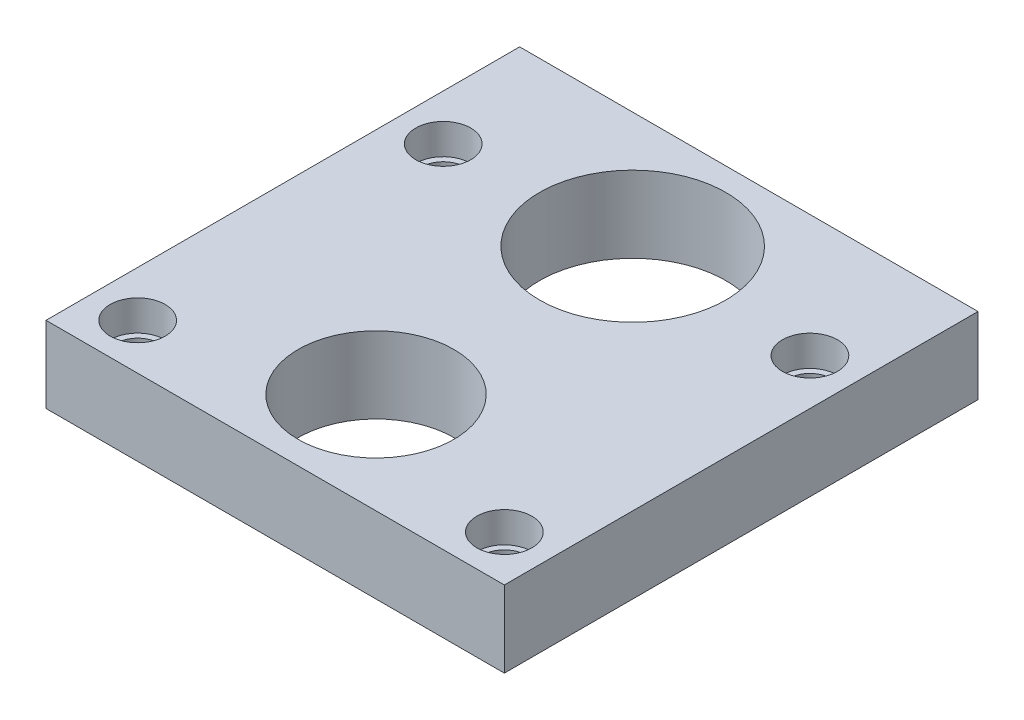
ISO-10303-21;
HEADER;
FILE_DESCRIPTION(('STEP AP214'),'2;1');
FILE_NAME('part.step','',(''),(''),'','','');
FILE_SCHEMA(('AUTOMOTIVE_DESIGN { 1 0 10303 214 1 1 1 1 }'));
ENDSEC;
DATA;
#1=APPLICATION_CONTEXT('core data for automotive mechanical design processes');
#2=APPLICATION_PROTOCOL_DEFINITION('international standard','automotive_design',2000,#1);
#3=PRODUCT_CONTEXT('',#1,'mechanical');
#4=PRODUCT('Part','Part','',(#3));
#5=PRODUCT_RELATED_PRODUCT_CATEGORY('part','',(#4));
#6=PRODUCT_DEFINITION_FORMATION('','',#4);
#7=PRODUCT_DEFINITION_CONTEXT('part definition',#1,'design');
#8=PRODUCT_DEFINITION('design','',#6,#7);
#9=PRODUCT_DEFINITION_SHAPE('','',#8);
#10=(LENGTH_UNIT() NAMED_UNIT(*) SI_UNIT(.MILLI.,.METRE.));
#11=(NAMED_UNIT(*) PLANE_ANGLE_UNIT() SI_UNIT($,.RADIAN.));
#12=(NAMED_UNIT(*) SI_UNIT($,.STERADIAN.) SOLID_ANGLE_UNIT());
#13=UNCERTAINTY_MEASURE_WITH_UNIT(LENGTH_MEASURE(1.E-05),#10,'distance_accuracy_value','');
#14=(GEOMETRIC_REPRESENTATION_CONTEXT(3) GLOBAL_UNCERTAINTY_ASSIGNED_CONTEXT((#13)) GLOBAL_UNIT_ASSIGNED_CONTEXT((#10,
#11,#12)) REPRESENTATION_CONTEXT('',''));
#15=CARTESIAN_POINT('',(0.,0.,0.));
#16=DIRECTION('',(0.,0.,1.));
#17=DIRECTION('',(1.,0.,0.));
#18=AXIS2_PLACEMENT_3D('',#15,#16,#17);
#19=CARTESIAN_POINT('',(0.,2.5,0.));
#20=DIRECTION('',(0.,-1.,0.));
#21=DIRECTION('',(0.,0.,-1.));
#22=AXIS2_PLACEMENT_3D('',#19,#20,#21);
#23=PLANE('',#22);
#24=CARTESIAN_POINT('',(-6.,2.5,-3.5));
#25=DIRECTION('',(0.,-1.,0.));
#26=DIRECTION('',(0.,0.,-1.));
#27=AXIS2_PLACEMENT_3D('',#24,#25,#26);
#28=CIRCLE('',#27,0.9);
#29=CARTESIAN_POINT('',(-6.,2.5,-4.4));
#30=VERTEX_POINT('',#29);
#31=EDGE_CURVE('E159',#30,#30,#28,.T.);
#32=ORIENTED_EDGE('',*,*,#31,.T.);
#33=EDGE_LOOP('',(#32));
#34=FACE_BOUND('',#33,.T.);
#35=CARTESIAN_POINT('',(6.,2.5,6.5));
#36=DIRECTION('',(0.,-1.,0.));
#37=DIRECTION('',(0.,0.,-1.));
#38=AXIS2_PLACEMENT_3D('',#35,#36,#37);
#39=CIRCLE('',#38,0.9);
#40=CARTESIAN_POINT('',(6.,2.5,5.6));
#41=VERTEX_POINT('',#40);
#42=EDGE_CURVE('E384',#41,#41,#39,.T.);
#43=ORIENTED_EDGE('',*,*,#42,.T.);
#44=EDGE_LOOP('',(#43));
#45=FACE_BOUND('',#44,.T.);
#46=CARTESIAN_POINT('',(6.,2.5,-3.5));
#47=DIRECTION('',(0.,-1.,0.));
#48=DIRECTION('',(0.,0.,-1.));
#49=AXIS2_PLACEMENT_3D('',#46,#47,#48);
#50=CIRCLE('',#49,0.9);
#51=CARTESIAN_POINT('',(6.,2.5,-4.4));
#52=VERTEX_POINT('',#51);
#53=EDGE_CURVE('E175',#52,#52,#50,.T.);
#54=ORIENTED_EDGE('',*,*,#53,.T.);
#55=EDGE_LOOP('',(#54));
#56=FACE_BOUND('',#55,.T.);
#57=CARTESIAN_POINT('',(-6.,2.5,6.5));
#58=DIRECTION('',(0.,-1.,0.));
#59=DIRECTION('',(0.,0.,-1.));
#60=AXIS2_PLACEMENT_3D('',#57,#58,#59);
#61=CIRCLE('',#60,0.899999999999999);
#62=CARTESIAN_POINT('',(-6.,2.5,5.6));
#63=VERTEX_POINT('',#62);
#64=EDGE_CURVE('E172',#63,#63,#61,.T.);
#65=ORIENTED_EDGE('',*,*,#64,.T.);
#66=EDGE_LOOP('',(#65));
#67=FACE_BOUND('',#66,.T.);
#68=DIRECTION('',(1.,0.,0.));
#69=VECTOR('',#68,1.);
#70=CARTESIAN_POINT('',(-7.5,2.5,-7.5));
#71=LINE('',#70,#69);
#72=CARTESIAN_POINT('',(-7.5,2.5,-7.5));
#73=VERTEX_POINT('',#72);
#74=CARTESIAN_POINT('',(7.5,2.5,-7.5));
#75=VERTEX_POINT('',#74);
#76=EDGE_CURVE('E128',#73,#75,#71,.T.);
#77=ORIENTED_EDGE('',*,*,#76,.F.);
#78=DIRECTION('',(0.,0.,1.));
#79=VECTOR('',#78,1.);
#80=CARTESIAN_POINT('',(-7.5,2.5,-7.5));
#81=LINE('',#80,#79);
#82=CARTESIAN_POINT('',(-7.5,2.5,8.));
#83=VERTEX_POINT('',#82);
#84=EDGE_CURVE('E117',#73,#83,#81,.T.);
#85=ORIENTED_EDGE('',*,*,#84,.T.);
#86=DIRECTION('',(1.,0.,0.));
#87=VECTOR('',#86,1.);
#88=CARTESIAN_POINT('',(-7.5,2.5,8.));
#89=LINE('',#88,#87);
#90=CARTESIAN_POINT('',(7.5,2.5,8.));
#91=VERTEX_POINT('',#90);
#92=EDGE_CURVE('E112',#83,#91,#89,.T.);
#93=ORIENTED_EDGE('',*,*,#92,.T.);
#94=DIRECTION('',(0.,0.,1.));
#95=VECTOR('',#94,1.);
#96=CARTESIAN_POINT('',(7.5,2.5,-7.5));
#97=LINE('',#96,#95);
#98=EDGE_CURVE('E116',#75,#91,#97,.T.);
#99=ORIENTED_EDGE('',*,*,#98,.F.);
#100=EDGE_LOOP('',(#77,#85,#93,#99));
#101=FACE_BOUND('',#100,.T.);
#102=CARTESIAN_POINT('',(0.,2.5,-3.7));
#103=DIRECTION('',(0.,1.,0.));
#104=DIRECTION('',(0.,0.,1.));
#105=AXIS2_PLACEMENT_3D('',#102,#103,#104);
#106=CIRCLE('',#105,3.05);
#107=CARTESIAN_POINT('',(0.,2.5,-0.650000000000001));
#108=VERTEX_POINT('',#107);
#109=EDGE_CURVE('E138',#108,#108,#106,.T.);
#110=ORIENTED_EDGE('',*,*,#109,.F.);
#111=EDGE_LOOP('',(#110));
#112=FACE_BOUND('',#111,.T.);
#113=CARTESIAN_POINT('',(0.,2.5,4.7));
#114=DIRECTION('',(0.,1.,0.));
#115=DIRECTION('',(0.,0.,1.));
#116=AXIS2_PLACEMENT_3D('',#113,#114,#115);
#117=CIRCLE('',#116,2.55);
#118=CARTESIAN_POINT('',(0.,2.5,7.25));
#119=VERTEX_POINT('',#118);
#120=EDGE_CURVE('E176',#119,#119,#117,.T.);
#121=ORIENTED_EDGE('',*,*,#120,.F.);
#122=EDGE_LOOP('',(#121));
#123=FACE_BOUND('',#122,.T.);
#124=ADVANCED_FACE('F65',(#34,#45,#56,#67,#101,#112,#123),#23,.F.);
#125=CARTESIAN_POINT('',(0.,0.,0.));
#126=DIRECTION('',(0.,-1.,0.));
#127=DIRECTION('',(0.,0.,-1.));
#128=AXIS2_PLACEMENT_3D('',#125,#126,#127);
#129=PLANE('',#128);
#130=CARTESIAN_POINT('',(6.,0.,6.5));
#131=DIRECTION('',(0.,-1.,0.));
#132=DIRECTION('',(0.,0.,-1.));
#133=AXIS2_PLACEMENT_3D('',#130,#131,#132);
#134=CIRCLE('',#133,0.7);
#135=CARTESIAN_POINT('',(6.,0.,5.8));
#136=VERTEX_POINT('',#135);
#137=EDGE_CURVE('E377',#136,#136,#134,.T.);
#138=ORIENTED_EDGE('',*,*,#137,.F.);
#139=EDGE_LOOP('',(#138));
#140=FACE_BOUND('',#139,.T.);
#141=CARTESIAN_POINT('',(-6.,0.,-3.5));
#142=DIRECTION('',(0.,-1.,0.));
#143=DIRECTION('',(0.,0.,-1.));
#144=AXIS2_PLACEMENT_3D('',#141,#142,#143);
#145=CIRCLE('',#144,0.7);
#146=CARTESIAN_POINT('',(-6.,0.,-4.2));
#147=VERTEX_POINT('',#146);
#148=EDGE_CURVE('E373',#147,#147,#145,.T.);
#149=ORIENTED_EDGE('',*,*,#148,.F.);
#150=EDGE_LOOP('',(#149));
#151=FACE_BOUND('',#150,.T.);
#152=CARTESIAN_POINT('',(6.,0.,-3.5));
#153=DIRECTION('',(0.,-1.,0.));
#154=DIRECTION('',(0.,0.,-1.));
#155=AXIS2_PLACEMENT_3D('',#152,#153,#154);
#156=CIRCLE('',#155,0.7);
#157=CARTESIAN_POINT('',(6.,0.,-4.2));
#158=VERTEX_POINT('',#157);
#159=EDGE_CURVE('E370',#158,#158,#156,.T.);
#160=ORIENTED_EDGE('',*,*,#159,.F.);
#161=EDGE_LOOP('',(#160));
#162=FACE_BOUND('',#161,.T.);
#163=CARTESIAN_POINT('',(-6.,0.,6.5));
#164=DIRECTION('',(0.,-1.,0.));
#165=DIRECTION('',(0.,0.,-1.));
#166=AXIS2_PLACEMENT_3D('',#163,#164,#165);
#167=CIRCLE('',#166,0.7);
#168=CARTESIAN_POINT('',(-6.,0.,5.8));
#169=VERTEX_POINT('',#168);
#170=EDGE_CURVE('E148',#169,#169,#167,.T.);
#171=ORIENTED_EDGE('',*,*,#170,.F.);
#172=EDGE_LOOP('',(#171));
#173=FACE_BOUND('',#172,.T.);
#174=CARTESIAN_POINT('',(0.,0.,-3.7));
#175=DIRECTION('',(0.,1.,0.));
#176=DIRECTION('',(0.,0.,1.));
#177=AXIS2_PLACEMENT_3D('',#174,#175,#176);
#178=CIRCLE('',#177,3.05);
#179=CARTESIAN_POINT('',(0.,0.,-0.650000000000001));
#180=VERTEX_POINT('',#179);
#181=EDGE_CURVE('E179',#180,#180,#178,.T.);
#182=ORIENTED_EDGE('',*,*,#181,.T.);
#183=EDGE_LOOP('',(#182));
#184=FACE_BOUND('',#183,.T.);
#185=DIRECTION('',(1.,0.,0.));
#186=VECTOR('',#185,1.);
#187=CARTESIAN_POINT('',(-7.5,0.,-7.5));
#188=LINE('',#187,#186);
#189=CARTESIAN_POINT('',(-7.5,0.,-7.5));
#190=VERTEX_POINT('',#189);
#191=CARTESIAN_POINT('',(7.5,0.,-7.5));
#192=VERTEX_POINT('',#191);
#193=EDGE_CURVE('E134',#190,#192,#188,.T.);
#194=ORIENTED_EDGE('',*,*,#193,.T.);
#195=DIRECTION('',(0.,0.,1.));
#196=VECTOR('',#195,1.);
#197=CARTESIAN_POINT('',(7.5,0.,-7.5));
#198=LINE('',#197,#196);
#199=CARTESIAN_POINT('',(7.5,0.,8.));
#200=VERTEX_POINT('',#199);
#201=EDGE_CURVE('E137',#192,#200,#198,.T.);
#202=ORIENTED_EDGE('',*,*,#201,.T.);
#203=DIRECTION('',(1.,0.,0.));
#204=VECTOR('',#203,1.);
#205=CARTESIAN_POINT('',(-7.5,0.,8.));
#206=LINE('',#205,#204);
#207=CARTESIAN_POINT('',(-7.5,0.,8.));
#208=VERTEX_POINT('',#207);
#209=EDGE_CURVE('E124',#208,#200,#206,.T.);
#210=ORIENTED_EDGE('',*,*,#209,.F.);
#211=DIRECTION('',(0.,0.,1.));
#212=VECTOR('',#211,1.);
#213=CARTESIAN_POINT('',(-7.5,0.,-7.5));
#214=LINE('',#213,#212);
#215=EDGE_CURVE('E99',#190,#208,#214,.T.);
#216=ORIENTED_EDGE('',*,*,#215,.F.);
#217=EDGE_LOOP('',(#194,#202,#210,#216));
#218=FACE_BOUND('',#217,.T.);
#219=CARTESIAN_POINT('',(0.,0.,4.7));
#220=DIRECTION('',(0.,1.,0.));
#221=DIRECTION('',(0.,0.,1.));
#222=AXIS2_PLACEMENT_3D('',#219,#220,#221);
#223=CIRCLE('',#222,2.55);
#224=CARTESIAN_POINT('',(0.,0.,7.25));
#225=VERTEX_POINT('',#224);
#226=EDGE_CURVE('E171',#225,#225,#223,.T.);
#227=ORIENTED_EDGE('',*,*,#226,.T.);
#228=EDGE_LOOP('',(#227));
#229=FACE_BOUND('',#228,.T.);
#230=ADVANCED_FACE('F186',(#140,#151,#162,#173,#184,#218,#229),#129,.T.);
#231=CARTESIAN_POINT('',(-7.5,2.5,-7.5));
#232=DIRECTION('',(0.,0.,-1.));
#233=DIRECTION('',(-1.,0.,0.));
#234=AXIS2_PLACEMENT_3D('',#231,#232,#233);
#235=PLANE('',#234);
#236=ORIENTED_EDGE('',*,*,#193,.F.);
#237=DIRECTION('',(0.,-1.,0.));
#238=VECTOR('',#237,1.);
#239=CARTESIAN_POINT('',(-7.5,2.5,-7.5));
#240=LINE('',#239,#238);
#241=EDGE_CURVE('E12',#73,#190,#240,.T.);
#242=ORIENTED_EDGE('',*,*,#241,.F.);
#243=ORIENTED_EDGE('',*,*,#76,.T.);
#244=DIRECTION('',(0.,-1.,0.));
#245=VECTOR('',#244,1.);
#246=CARTESIAN_POINT('',(7.5,2.5,-7.5));
#247=LINE('',#246,#245);
#248=EDGE_CURVE('E107',#75,#192,#247,.T.);
#249=ORIENTED_EDGE('',*,*,#248,.T.);
#250=EDGE_LOOP('',(#236,#242,#243,#249));
#251=FACE_BOUND('',#250,.T.);
#252=ADVANCED_FACE('F67',(#251),#235,.T.);
#253=CARTESIAN_POINT('',(-7.5,2.5,-7.5));
#254=DIRECTION('',(1.,0.,0.));
#255=DIRECTION('',(0.,0.,-1.));
#256=AXIS2_PLACEMENT_3D('',#253,#254,#255);
#257=PLANE('',#256);
#258=ORIENTED_EDGE('',*,*,#215,.T.);
#259=DIRECTION('',(0.,-1.,0.));
#260=VECTOR('',#259,1.);
#261=CARTESIAN_POINT('',(-7.5,2.5,8.));
#262=LINE('',#261,#260);
#263=EDGE_CURVE('E75',#83,#208,#262,.T.);
#264=ORIENTED_EDGE('',*,*,#263,.F.);
#265=ORIENTED_EDGE('',*,*,#84,.F.);
#266=ORIENTED_EDGE('',*,*,#241,.T.);
#267=EDGE_LOOP('',(#258,#264,#265,#266));
#268=FACE_BOUND('',#267,.T.);
#269=ADVANCED_FACE('F211',(#268),#257,.F.);
#270=CARTESIAN_POINT('',(-7.5,2.5,8.));
#271=DIRECTION('',(0.,0.,-1.));
#272=DIRECTION('',(-1.,0.,0.));
#273=AXIS2_PLACEMENT_3D('',#270,#271,#272);
#274=PLANE('',#273);
#275=ORIENTED_EDGE('',*,*,#209,.T.);
#276=DIRECTION('',(0.,-1.,0.));
#277=VECTOR('',#276,1.);
#278=CARTESIAN_POINT('',(7.5,2.5,8.));
#279=LINE('',#278,#277);
#280=EDGE_CURVE('E121',#91,#200,#279,.T.);
#281=ORIENTED_EDGE('',*,*,#280,.F.);
#282=ORIENTED_EDGE('',*,*,#92,.F.);
#283=ORIENTED_EDGE('',*,*,#263,.T.);
#284=EDGE_LOOP('',(#275,#281,#282,#283));
#285=FACE_BOUND('',#284,.T.);
#286=ADVANCED_FACE('F122',(#285),#274,.F.);
#287=CARTESIAN_POINT('',(7.5,2.5,-7.5));
#288=DIRECTION('',(1.,0.,0.));
#289=DIRECTION('',(0.,0.,-1.));
#290=AXIS2_PLACEMENT_3D('',#287,#288,#289);
#291=PLANE('',#290);
#292=ORIENTED_EDGE('',*,*,#201,.F.);
#293=ORIENTED_EDGE('',*,*,#248,.F.);
#294=ORIENTED_EDGE('',*,*,#98,.T.);
#295=ORIENTED_EDGE('',*,*,#280,.T.);
#296=EDGE_LOOP('',(#292,#293,#294,#295));
#297=FACE_BOUND('',#296,.T.);
#298=ADVANCED_FACE('F127',(#297),#291,.T.);
#299=CARTESIAN_POINT('',(0.,2.5,-3.7));
#300=DIRECTION('',(0.,-1.,0.));
#301=DIRECTION('',(0.,0.,-1.));
#302=AXIS2_PLACEMENT_3D('',#299,#300,#301);
#303=CYLINDRICAL_SURFACE('',#302,3.05);
#304=ORIENTED_EDGE('',*,*,#109,.T.);
#305=EDGE_LOOP('',(#304));
#306=FACE_BOUND('',#305,.T.);
#307=ORIENTED_EDGE('',*,*,#181,.F.);
#308=EDGE_LOOP('',(#307));
#309=FACE_BOUND('',#308,.T.);
#310=ADVANCED_FACE('F189',(#306,#309),#303,.F.);
#311=CARTESIAN_POINT('',(0.,2.5,4.7));
#312=DIRECTION('',(0.,-1.,0.));
#313=DIRECTION('',(0.,0.,-1.));
#314=AXIS2_PLACEMENT_3D('',#311,#312,#313);
#315=CYLINDRICAL_SURFACE('',#314,2.55);
#316=ORIENTED_EDGE('',*,*,#120,.T.);
#317=EDGE_LOOP('',(#316));
#318=FACE_BOUND('',#317,.T.);
#319=ORIENTED_EDGE('',*,*,#226,.F.);
#320=EDGE_LOOP('',(#319));
#321=FACE_BOUND('',#320,.T.);
#322=ADVANCED_FACE('F191',(#318,#321),#315,.F.);
#323=CARTESIAN_POINT('',(-6.,1.5,6.5));
#324=DIRECTION('',(0.,1.,0.));
#325=DIRECTION('',(0.,0.,1.));
#326=AXIS2_PLACEMENT_3D('',#323,#324,#325);
#327=CYLINDRICAL_SURFACE('',#326,0.899999999999999);
#328=CARTESIAN_POINT('',(-6.,1.5,6.5));
#329=DIRECTION('',(0.,-1.,0.));
#330=DIRECTION('',(0.,0.,-1.));
#331=AXIS2_PLACEMENT_3D('',#328,#329,#330);
#332=CIRCLE('',#331,0.899999999999999);
#333=CARTESIAN_POINT('',(-6.,1.5,5.6));
#334=VERTEX_POINT('',#333);
#335=EDGE_CURVE('E168',#334,#334,#332,.T.);
#336=ORIENTED_EDGE('',*,*,#335,.T.);
#337=EDGE_LOOP('',(#336));
#338=FACE_BOUND('',#337,.T.);
#339=ORIENTED_EDGE('',*,*,#64,.F.);
#340=EDGE_LOOP('',(#339));
#341=FACE_BOUND('',#340,.T.);
#342=ADVANCED_FACE('F198',(#338,#341),#327,.F.);
#343=CARTESIAN_POINT('',(-6.,1.5,6.5));
#344=DIRECTION('',(0.,-1.,0.));
#345=DIRECTION('',(0.,0.,-1.));
#346=AXIS2_PLACEMENT_3D('',#343,#344,#345);
#347=PLANE('',#346);
#348=CARTESIAN_POINT('',(-6.,1.5,6.5));
#349=DIRECTION('',(0.,-1.,0.));
#350=DIRECTION('',(0.,0.,-1.));
#351=AXIS2_PLACEMENT_3D('',#348,#349,#350);
#352=CIRCLE('',#351,0.7);
#353=CARTESIAN_POINT('',(-6.,1.5,5.8));
#354=VERTEX_POINT('',#353);
#355=EDGE_CURVE('E69',#354,#354,#352,.F.);
#356=ORIENTED_EDGE('',*,*,#355,.F.);
#357=EDGE_LOOP('',(#356));
#358=FACE_BOUND('',#357,.T.);
#359=ORIENTED_EDGE('',*,*,#335,.F.);
#360=EDGE_LOOP('',(#359));
#361=FACE_BOUND('',#360,.T.);
#362=ADVANCED_FACE('F248',(#358,#361),#347,.F.);
#363=CARTESIAN_POINT('',(6.,1.5,-3.5));
#364=DIRECTION('',(0.,1.,0.));
#365=DIRECTION('',(0.,0.,1.));
#366=AXIS2_PLACEMENT_3D('',#363,#364,#365);
#367=CYLINDRICAL_SURFACE('',#366,0.9);
#368=CARTESIAN_POINT('',(6.,1.5,-3.5));
#369=DIRECTION('',(0.,-1.,0.));
#370=DIRECTION('',(0.,0.,-1.));
#371=AXIS2_PLACEMENT_3D('',#368,#369,#370);
#372=CIRCLE('',#371,0.9);
#373=CARTESIAN_POINT('',(6.,1.5,-4.4));
#374=VERTEX_POINT('',#373);
#375=EDGE_CURVE('E381',#374,#374,#372,.T.);
#376=ORIENTED_EDGE('',*,*,#375,.T.);
#377=EDGE_LOOP('',(#376));
#378=FACE_BOUND('',#377,.T.);
#379=ORIENTED_EDGE('',*,*,#53,.F.);
#380=EDGE_LOOP('',(#379));
#381=FACE_BOUND('',#380,.T.);
#382=ADVANCED_FACE('F256',(#378,#381),#367,.F.);
#383=CARTESIAN_POINT('',(6.,1.5,-3.5));
#384=DIRECTION('',(0.,-1.,0.));
#385=DIRECTION('',(0.,0.,-1.));
#386=AXIS2_PLACEMENT_3D('',#383,#384,#385);
#387=PLANE('',#386);
#388=CARTESIAN_POINT('',(6.,1.5,-3.5));
#389=DIRECTION('',(0.,-1.,0.));
#390=DIRECTION('',(0.,0.,-1.));
#391=AXIS2_PLACEMENT_3D('',#388,#389,#390);
#392=CIRCLE('',#391,0.7);
#393=CARTESIAN_POINT('',(6.,1.5,-4.2));
#394=VERTEX_POINT('',#393);
#395=EDGE_CURVE('E150',#394,#394,#392,.F.);
#396=ORIENTED_EDGE('',*,*,#395,.F.);
#397=EDGE_LOOP('',(#396));
#398=FACE_BOUND('',#397,.T.);
#399=ORIENTED_EDGE('',*,*,#375,.F.);
#400=EDGE_LOOP('',(#399));
#401=FACE_BOUND('',#400,.T.);
#402=ADVANCED_FACE('F261',(#398,#401),#387,.F.);
#403=CARTESIAN_POINT('',(6.,1.5,6.5));
#404=DIRECTION('',(0.,1.,0.));
#405=DIRECTION('',(0.,0.,1.));
#406=AXIS2_PLACEMENT_3D('',#403,#404,#405);
#407=CYLINDRICAL_SURFACE('',#406,0.9);
#408=CARTESIAN_POINT('',(6.,1.5,6.5));
#409=DIRECTION('',(0.,-1.,0.));
#410=DIRECTION('',(0.,0.,-1.));
#411=AXIS2_PLACEMENT_3D('',#408,#409,#410);
#412=CIRCLE('',#411,0.9);
#413=CARTESIAN_POINT('',(6.,1.5,5.6));
#414=VERTEX_POINT('',#413);
#415=EDGE_CURVE('E164',#414,#414,#412,.T.);
#416=ORIENTED_EDGE('',*,*,#415,.T.);
#417=EDGE_LOOP('',(#416));
#418=FACE_BOUND('',#417,.T.);
#419=ORIENTED_EDGE('',*,*,#42,.F.);
#420=EDGE_LOOP('',(#419));
#421=FACE_BOUND('',#420,.T.);
#422=ADVANCED_FACE('F269',(#418,#421),#407,.F.);
#423=CARTESIAN_POINT('',(6.,1.5,6.5));
#424=DIRECTION('',(0.,-1.,0.));
#425=DIRECTION('',(0.,0.,-1.));
#426=AXIS2_PLACEMENT_3D('',#423,#424,#425);
#427=PLANE('',#426);
#428=CARTESIAN_POINT('',(6.,1.5,6.5));
#429=DIRECTION('',(0.,-1.,0.));
#430=DIRECTION('',(0.,0.,-1.));
#431=AXIS2_PLACEMENT_3D('',#428,#429,#430);
#432=CIRCLE('',#431,0.7);
#433=CARTESIAN_POINT('',(6.,1.5,5.8));
#434=VERTEX_POINT('',#433);
#435=EDGE_CURVE('E147',#434,#434,#432,.F.);
#436=ORIENTED_EDGE('',*,*,#435,.F.);
#437=EDGE_LOOP('',(#436));
#438=FACE_BOUND('',#437,.T.);
#439=ORIENTED_EDGE('',*,*,#415,.F.);
#440=EDGE_LOOP('',(#439));
#441=FACE_BOUND('',#440,.T.);
#442=ADVANCED_FACE('F274',(#438,#441),#427,.F.);
#443=CARTESIAN_POINT('',(-6.,1.5,-3.5));
#444=DIRECTION('',(0.,1.,0.));
#445=DIRECTION('',(0.,0.,1.));
#446=AXIS2_PLACEMENT_3D('',#443,#444,#445);
#447=CYLINDRICAL_SURFACE('',#446,0.9);
#448=CARTESIAN_POINT('',(-6.,1.5,-3.5));
#449=DIRECTION('',(0.,-1.,0.));
#450=DIRECTION('',(0.,0.,-1.));
#451=AXIS2_PLACEMENT_3D('',#448,#449,#450);
#452=CIRCLE('',#451,0.9);
#453=CARTESIAN_POINT('',(-6.,1.5,-4.4));
#454=VERTEX_POINT('',#453);
#455=EDGE_CURVE('E155',#454,#454,#452,.T.);
#456=ORIENTED_EDGE('',*,*,#455,.T.);
#457=EDGE_LOOP('',(#456));
#458=FACE_BOUND('',#457,.T.);
#459=ORIENTED_EDGE('',*,*,#31,.F.);
#460=EDGE_LOOP('',(#459));
#461=FACE_BOUND('',#460,.T.);
#462=ADVANCED_FACE('F282',(#458,#461),#447,.F.);
#463=CARTESIAN_POINT('',(-6.,1.5,-3.5));
#464=DIRECTION('',(0.,-1.,0.));
#465=DIRECTION('',(0.,0.,-1.));
#466=AXIS2_PLACEMENT_3D('',#463,#464,#465);
#467=PLANE('',#466);
#468=CARTESIAN_POINT('',(-6.,1.5,-3.5));
#469=DIRECTION('',(0.,-1.,0.));
#470=DIRECTION('',(0.,0.,-1.));
#471=AXIS2_PLACEMENT_3D('',#468,#469,#470);
#472=CIRCLE('',#471,0.7);
#473=CARTESIAN_POINT('',(-6.,1.5,-4.2));
#474=VERTEX_POINT('',#473);
#475=EDGE_CURVE('E144',#474,#474,#472,.F.);
#476=ORIENTED_EDGE('',*,*,#475,.F.);
#477=EDGE_LOOP('',(#476));
#478=FACE_BOUND('',#477,.T.);
#479=ORIENTED_EDGE('',*,*,#455,.F.);
#480=EDGE_LOOP('',(#479));
#481=FACE_BOUND('',#480,.T.);
#482=ADVANCED_FACE('F287',(#478,#481),#467,.F.);
#483=CARTESIAN_POINT('',(-6.,0.,-3.5));
#484=DIRECTION('',(0.,1.,0.));
#485=DIRECTION('',(0.,0.,1.));
#486=AXIS2_PLACEMENT_3D('',#483,#484,#485);
#487=CYLINDRICAL_SURFACE('',#486,0.7);
#488=ORIENTED_EDGE('',*,*,#148,.T.);
#489=EDGE_LOOP('',(#488));
#490=FACE_BOUND('',#489,.T.);
#491=ORIENTED_EDGE('',*,*,#475,.T.);
#492=EDGE_LOOP('',(#491));
#493=FACE_BOUND('',#492,.T.);
#494=ADVANCED_FACE('F323',(#490,#493),#487,.F.);
#495=CARTESIAN_POINT('',(6.,0.,6.5));
#496=DIRECTION('',(0.,1.,0.));
#497=DIRECTION('',(0.,0.,1.));
#498=AXIS2_PLACEMENT_3D('',#495,#496,#497);
#499=CYLINDRICAL_SURFACE('',#498,0.7);
#500=ORIENTED_EDGE('',*,*,#137,.T.);
#501=EDGE_LOOP('',(#500));
#502=FACE_BOUND('',#501,.T.);
#503=ORIENTED_EDGE('',*,*,#435,.T.);
#504=EDGE_LOOP('',(#503));
#505=FACE_BOUND('',#504,.T.);
#506=ADVANCED_FACE('F333',(#502,#505),#499,.F.);
#507=CARTESIAN_POINT('',(6.,0.,-3.5));
#508=DIRECTION('',(0.,1.,0.));
#509=DIRECTION('',(0.,0.,1.));
#510=AXIS2_PLACEMENT_3D('',#507,#508,#509);
#511=CYLINDRICAL_SURFACE('',#510,0.7);
#512=ORIENTED_EDGE('',*,*,#159,.T.);
#513=EDGE_LOOP('',(#512));
#514=FACE_BOUND('',#513,.T.);
#515=ORIENTED_EDGE('',*,*,#395,.T.);
#516=EDGE_LOOP('',(#515));
#517=FACE_BOUND('',#516,.T.);
#518=ADVANCED_FACE('F343',(#514,#517),#511,.F.);
#519=CARTESIAN_POINT('',(-6.,0.,6.5));
#520=DIRECTION('',(0.,1.,0.));
#521=DIRECTION('',(0.,0.,1.));
#522=AXIS2_PLACEMENT_3D('',#519,#520,#521);
#523=CYLINDRICAL_SURFACE('',#522,0.7);
#524=ORIENTED_EDGE('',*,*,#170,.T.);
#525=EDGE_LOOP('',(#524));
#526=FACE_BOUND('',#525,.T.);
#527=ORIENTED_EDGE('',*,*,#355,.T.);
#528=EDGE_LOOP('',(#527));
#529=FACE_BOUND('',#528,.T.);
#530=ADVANCED_FACE('F353',(#526,#529),#523,.F.);
#531=CLOSED_SHELL('',(#124,#230,#252,#269,#286,#298,#310,#322,#342,#362,#382,#402,#422,#442,
#462,#482,#494,#506,#518,#530));
#532=MANIFOLD_SOLID_BREP('B2',#531);
#533=ADVANCED_BREP_SHAPE_REPRESENTATION('',(#18,#532),#14);
#534=SHAPE_DEFINITION_REPRESENTATION(#9,#533);
ENDSEC;
END-ISO-10303-21;
